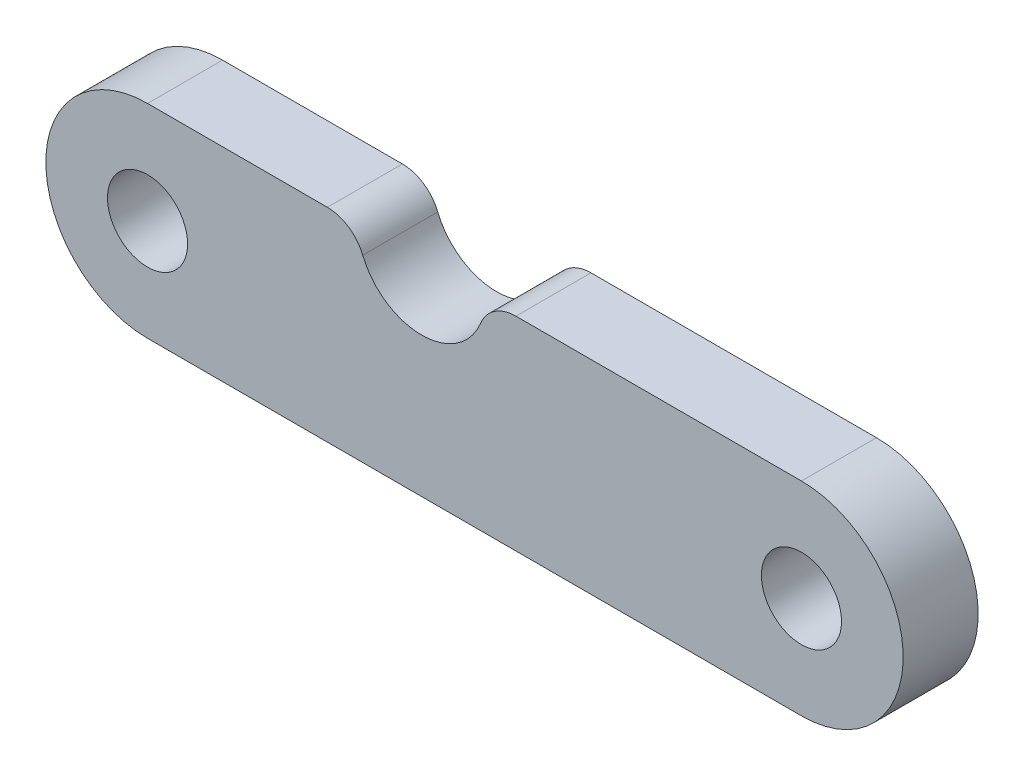
ISO-10303-21;
HEADER;
FILE_DESCRIPTION(('STEP AP214'),'2;1');
FILE_NAME('part.step','',(''),(''),'','','');
FILE_SCHEMA(('AUTOMOTIVE_DESIGN { 1 0 10303 214 1 1 1 1 }'));
ENDSEC;
DATA;
#1=APPLICATION_CONTEXT('core data for automotive mechanical design processes');
#2=APPLICATION_PROTOCOL_DEFINITION('international standard','automotive_design',2000,#1);
#3=PRODUCT_CONTEXT('',#1,'mechanical');
#4=PRODUCT('Part','Part','',(#3));
#5=PRODUCT_RELATED_PRODUCT_CATEGORY('part','',(#4));
#6=PRODUCT_DEFINITION_FORMATION('','',#4);
#7=PRODUCT_DEFINITION_CONTEXT('part definition',#1,'design');
#8=PRODUCT_DEFINITION('design','',#6,#7);
#9=PRODUCT_DEFINITION_SHAPE('','',#8);
#10=(LENGTH_UNIT() NAMED_UNIT(*) SI_UNIT(.MILLI.,.METRE.));
#11=(NAMED_UNIT(*) PLANE_ANGLE_UNIT() SI_UNIT($,.RADIAN.));
#12=(NAMED_UNIT(*) SI_UNIT($,.STERADIAN.) SOLID_ANGLE_UNIT());
#13=UNCERTAINTY_MEASURE_WITH_UNIT(LENGTH_MEASURE(1.E-05),#10,'distance_accuracy_value','');
#14=(GEOMETRIC_REPRESENTATION_CONTEXT(3) GLOBAL_UNCERTAINTY_ASSIGNED_CONTEXT((#13)) GLOBAL_UNIT_ASSIGNED_CONTEXT((#10,
#11,#12)) REPRESENTATION_CONTEXT('',''));
#15=CARTESIAN_POINT('',(0.,0.,0.));
#16=DIRECTION('',(0.,0.,1.));
#17=DIRECTION('',(1.,0.,0.));
#18=AXIS2_PLACEMENT_3D('',#15,#16,#17);
#19=CARTESIAN_POINT('',(25.7175,0.,5.9));
#20=DIRECTION('',(0.,0.,1.));
#21=DIRECTION('',(1.,0.,0.));
#22=AXIS2_PLACEMENT_3D('',#19,#20,#21);
#23=PLANE('',#22);
#24=CARTESIAN_POINT('',(25.7175,0.,5.9));
#25=DIRECTION('',(0.,0.,1.));
#26=DIRECTION('',(1.,0.,0.));
#27=AXIS2_PLACEMENT_3D('',#24,#25,#26);
#28=CIRCLE('',#27,3.15);
#29=CARTESIAN_POINT('',(28.8675,0.,5.9));
#30=VERTEX_POINT('',#29);
#31=EDGE_CURVE('E186',#30,#30,#28,.T.);
#32=ORIENTED_EDGE('',*,*,#31,.F.);
#33=EDGE_LOOP('',(#32));
#34=FACE_BOUND('',#33,.T.);
#35=DIRECTION('',(-1.,0.,0.));
#36=VECTOR('',#35,1.);
#37=CARTESIAN_POINT('',(25.7175,8.00000000000001,5.9));
#38=LINE('',#37,#36);
#39=CARTESIAN_POINT('',(25.7175,8.00000000000001,5.9));
#40=VERTEX_POINT('',#39);
#41=CARTESIAN_POINT('',(3.26059820623029,8.00000000000001,5.9));
#42=VERTEX_POINT('',#41);
#43=EDGE_CURVE('E113',#40,#42,#38,.T.);
#44=ORIENTED_EDGE('',*,*,#43,.T.);
#45=CARTESIAN_POINT('',(3.26059820623029,5.00000000000001,5.9));
#46=DIRECTION('',(0.,0.,1.));
#47=DIRECTION('',(1.,0.,0.));
#48=AXIS2_PLACEMENT_3D('',#45,#46,#47);
#49=CIRCLE('',#48,3.);
#50=CARTESIAN_POINT('',(0.479523773569421,6.12500000000001,5.9));
#51=VERTEX_POINT('',#50);
#52=EDGE_CURVE('E56',#42,#51,#49,.T.);
#53=ORIENTED_EDGE('',*,*,#52,.T.);
#54=CARTESIAN_POINT('',(-4.15560028086537,8.00000000000001,5.9));
#55=DIRECTION('',(0.,0.,-1.));
#56=DIRECTION('',(1.,0.,0.));
#57=AXIS2_PLACEMENT_3D('',#54,#55,#56);
#58=CIRCLE('',#57,5.);
#59=CARTESIAN_POINT('',(-8.79072433530015,6.125,5.9));
#60=VERTEX_POINT('',#59);
#61=EDGE_CURVE('E121',#51,#60,#58,.T.);
#62=ORIENTED_EDGE('',*,*,#61,.T.);
#63=CARTESIAN_POINT('',(-11.571798767961,5.,5.9));
#64=DIRECTION('',(0.,0.,1.));
#65=DIRECTION('',(1.,0.,0.));
#66=AXIS2_PLACEMENT_3D('',#63,#64,#65);
#67=CIRCLE('',#66,3.);
#68=CARTESIAN_POINT('',(-11.571798767961,8.,5.9));
#69=VERTEX_POINT('',#68);
#70=EDGE_CURVE('E63',#60,#69,#67,.T.);
#71=ORIENTED_EDGE('',*,*,#70,.T.);
#72=DIRECTION('',(-1.,0.,0.));
#73=VECTOR('',#72,1.);
#74=CARTESIAN_POINT('',(-9.15560028086537,8.,5.9));
#75=LINE('',#74,#73);
#76=CARTESIAN_POINT('',(-25.7175,8.,5.9));
#77=VERTEX_POINT('',#76);
#78=EDGE_CURVE('E172',#69,#77,#75,.T.);
#79=ORIENTED_EDGE('',*,*,#78,.T.);
#80=CARTESIAN_POINT('',(-25.7175,0.,5.9));
#81=DIRECTION('',(0.,0.,1.));
#82=DIRECTION('',(1.,0.,0.));
#83=AXIS2_PLACEMENT_3D('',#80,#81,#82);
#84=CIRCLE('',#83,8.);
#85=CARTESIAN_POINT('',(-25.7175,-8.00000000000001,5.9));
#86=VERTEX_POINT('',#85);
#87=EDGE_CURVE('E211',#77,#86,#84,.T.);
#88=ORIENTED_EDGE('',*,*,#87,.T.);
#89=DIRECTION('',(1.,0.,0.));
#90=VECTOR('',#89,1.);
#91=CARTESIAN_POINT('',(25.7175,-7.99999999999999,5.9));
#92=LINE('',#91,#90);
#93=CARTESIAN_POINT('',(25.7175,-7.99999999999999,5.9));
#94=VERTEX_POINT('',#93);
#95=EDGE_CURVE('E127',#86,#94,#92,.T.);
#96=ORIENTED_EDGE('',*,*,#95,.T.);
#97=CARTESIAN_POINT('',(25.7175,0.,5.9));
#98=DIRECTION('',(0.,0.,1.));
#99=DIRECTION('',(1.,0.,0.));
#100=AXIS2_PLACEMENT_3D('',#97,#98,#99);
#101=CIRCLE('',#100,8.);
#102=EDGE_CURVE('E122',#94,#40,#101,.T.);
#103=ORIENTED_EDGE('',*,*,#102,.T.);
#104=EDGE_LOOP('',(#44,#53,#62,#71,#79,#88,#96,#103));
#105=FACE_BOUND('',#104,.T.);
#106=CARTESIAN_POINT('',(-25.7175,0.,5.9));
#107=DIRECTION('',(0.,0.,1.));
#108=DIRECTION('',(1.,0.,0.));
#109=AXIS2_PLACEMENT_3D('',#106,#107,#108);
#110=CIRCLE('',#109,3.15);
#111=CARTESIAN_POINT('',(-22.5675,0.,5.9));
#112=VERTEX_POINT('',#111);
#113=EDGE_CURVE('E319',#112,#112,#110,.T.);
#114=ORIENTED_EDGE('',*,*,#113,.F.);
#115=EDGE_LOOP('',(#114));
#116=FACE_BOUND('',#115,.T.);
#117=ADVANCED_FACE('F47',(#34,#105,#116),#23,.T.);
#118=CARTESIAN_POINT('',(25.7175,0.,0.));
#119=DIRECTION('',(0.,0.,1.));
#120=DIRECTION('',(1.,0.,0.));
#121=AXIS2_PLACEMENT_3D('',#118,#119,#120);
#122=PLANE('',#121);
#123=CARTESIAN_POINT('',(-4.15560028086537,8.00000000000001,0.));
#124=DIRECTION('',(0.,0.,-1.));
#125=DIRECTION('',(1.,0.,0.));
#126=AXIS2_PLACEMENT_3D('',#123,#124,#125);
#127=CIRCLE('',#126,5.);
#128=CARTESIAN_POINT('',(0.479523773569421,6.12500000000001,0.));
#129=VERTEX_POINT('',#128);
#130=CARTESIAN_POINT('',(-8.79072433530015,6.125,0.));
#131=VERTEX_POINT('',#130);
#132=EDGE_CURVE('E179',#129,#131,#127,.T.);
#133=ORIENTED_EDGE('',*,*,#132,.F.);
#134=CARTESIAN_POINT('',(3.26059820623029,5.00000000000001,0.));
#135=DIRECTION('',(0.,0.,1.));
#136=DIRECTION('',(1.,0.,0.));
#137=AXIS2_PLACEMENT_3D('',#134,#135,#136);
#138=CIRCLE('',#137,3.);
#139=CARTESIAN_POINT('',(3.26059820623029,8.00000000000001,0.));
#140=VERTEX_POINT('',#139);
#141=EDGE_CURVE('E156',#129,#140,#138,.F.);
#142=ORIENTED_EDGE('',*,*,#141,.T.);
#143=DIRECTION('',(-1.,0.,0.));
#144=VECTOR('',#143,1.);
#145=CARTESIAN_POINT('',(25.7175,8.00000000000001,0.));
#146=LINE('',#145,#144);
#147=CARTESIAN_POINT('',(25.7175,8.00000000000001,0.));
#148=VERTEX_POINT('',#147);
#149=EDGE_CURVE('E178',#148,#140,#146,.T.);
#150=ORIENTED_EDGE('',*,*,#149,.F.);
#151=CARTESIAN_POINT('',(25.7175,0.,0.));
#152=DIRECTION('',(0.,0.,1.));
#153=DIRECTION('',(1.,0.,0.));
#154=AXIS2_PLACEMENT_3D('',#151,#152,#153);
#155=CIRCLE('',#154,8.);
#156=CARTESIAN_POINT('',(25.7175,-7.99999999999999,0.));
#157=VERTEX_POINT('',#156);
#158=EDGE_CURVE('E136',#157,#148,#155,.T.);
#159=ORIENTED_EDGE('',*,*,#158,.F.);
#160=DIRECTION('',(1.,0.,0.));
#161=VECTOR('',#160,1.);
#162=CARTESIAN_POINT('',(25.7175,-7.99999999999999,0.));
#163=LINE('',#162,#161);
#164=CARTESIAN_POINT('',(-25.7175,-8.00000000000001,0.));
#165=VERTEX_POINT('',#164);
#166=EDGE_CURVE('E132',#165,#157,#163,.T.);
#167=ORIENTED_EDGE('',*,*,#166,.F.);
#168=CARTESIAN_POINT('',(-25.7175,0.,0.));
#169=DIRECTION('',(0.,0.,1.));
#170=DIRECTION('',(1.,0.,0.));
#171=AXIS2_PLACEMENT_3D('',#168,#169,#170);
#172=CIRCLE('',#171,8.);
#173=CARTESIAN_POINT('',(-25.7175,8.,0.));
#174=VERTEX_POINT('',#173);
#175=EDGE_CURVE('E192',#174,#165,#172,.T.);
#176=ORIENTED_EDGE('',*,*,#175,.F.);
#177=DIRECTION('',(-1.,0.,0.));
#178=VECTOR('',#177,1.);
#179=CARTESIAN_POINT('',(-9.15560028086537,8.,0.));
#180=LINE('',#179,#178);
#181=CARTESIAN_POINT('',(-11.571798767961,8.,0.));
#182=VERTEX_POINT('',#181);
#183=EDGE_CURVE('E184',#182,#174,#180,.T.);
#184=ORIENTED_EDGE('',*,*,#183,.F.);
#185=CARTESIAN_POINT('',(-11.571798767961,5.,0.));
#186=DIRECTION('',(0.,0.,1.));
#187=DIRECTION('',(1.,0.,0.));
#188=AXIS2_PLACEMENT_3D('',#185,#186,#187);
#189=CIRCLE('',#188,3.);
#190=EDGE_CURVE('E153',#182,#131,#189,.F.);
#191=ORIENTED_EDGE('',*,*,#190,.T.);
#192=EDGE_LOOP('',(#133,#142,#150,#159,#167,#176,#184,#191));
#193=FACE_BOUND('',#192,.T.);
#194=CARTESIAN_POINT('',(25.7175,0.,0.));
#195=DIRECTION('',(0.,0.,1.));
#196=DIRECTION('',(1.,0.,0.));
#197=AXIS2_PLACEMENT_3D('',#194,#195,#196);
#198=CIRCLE('',#197,3.15);
#199=CARTESIAN_POINT('',(28.8675,0.,0.));
#200=VERTEX_POINT('',#199);
#201=EDGE_CURVE('E327',#200,#200,#198,.T.);
#202=ORIENTED_EDGE('',*,*,#201,.T.);
#203=EDGE_LOOP('',(#202));
#204=FACE_BOUND('',#203,.T.);
#205=CARTESIAN_POINT('',(-25.7175,0.,0.));
#206=DIRECTION('',(0.,0.,1.));
#207=DIRECTION('',(1.,0.,0.));
#208=AXIS2_PLACEMENT_3D('',#205,#206,#207);
#209=CIRCLE('',#208,3.15);
#210=CARTESIAN_POINT('',(-22.5675,0.,0.));
#211=VERTEX_POINT('',#210);
#212=EDGE_CURVE('E322',#211,#211,#209,.T.);
#213=ORIENTED_EDGE('',*,*,#212,.T.);
#214=EDGE_LOOP('',(#213));
#215=FACE_BOUND('',#214,.T.);
#216=ADVANCED_FACE('F176',(#193,#204,#215),#122,.F.);
#217=CARTESIAN_POINT('',(25.7175,0.,5.9));
#218=DIRECTION('',(0.,0.,-1.));
#219=DIRECTION('',(-1.,0.,0.));
#220=AXIS2_PLACEMENT_3D('',#217,#218,#219);
#221=CYLINDRICAL_SURFACE('',#220,8.);
#222=ORIENTED_EDGE('',*,*,#158,.T.);
#223=DIRECTION('',(0.,0.,-1.));
#224=VECTOR('',#223,1.);
#225=CARTESIAN_POINT('',(25.7175,8.00000000000001,5.9));
#226=LINE('',#225,#224);
#227=EDGE_CURVE('E117',#40,#148,#226,.T.);
#228=ORIENTED_EDGE('',*,*,#227,.F.);
#229=ORIENTED_EDGE('',*,*,#102,.F.);
#230=DIRECTION('',(0.,0.,-1.));
#231=VECTOR('',#230,1.);
#232=CARTESIAN_POINT('',(25.7175,-7.99999999999999,5.9));
#233=LINE('',#232,#231);
#234=EDGE_CURVE('E197',#94,#157,#233,.T.);
#235=ORIENTED_EDGE('',*,*,#234,.T.);
#236=EDGE_LOOP('',(#222,#228,#229,#235));
#237=FACE_BOUND('',#236,.T.);
#238=ADVANCED_FACE('F134',(#237),#221,.T.);
#239=CARTESIAN_POINT('',(25.7175,8.00000000000001,5.9));
#240=DIRECTION('',(0.,-1.,0.));
#241=DIRECTION('',(1.,0.,0.));
#242=AXIS2_PLACEMENT_3D('',#239,#240,#241);
#243=PLANE('',#242);
#244=ORIENTED_EDGE('',*,*,#149,.T.);
#245=DIRECTION('',(0.,0.,-1.));
#246=VECTOR('',#245,1.);
#247=CARTESIAN_POINT('',(3.26059820623029,8.00000000000001,5.9));
#248=LINE('',#247,#246);
#249=EDGE_CURVE('E71',#140,#42,#248,.F.);
#250=ORIENTED_EDGE('',*,*,#249,.T.);
#251=ORIENTED_EDGE('',*,*,#43,.F.);
#252=ORIENTED_EDGE('',*,*,#227,.T.);
#253=EDGE_LOOP('',(#244,#250,#251,#252));
#254=FACE_BOUND('',#253,.T.);
#255=ADVANCED_FACE('F115',(#254),#243,.F.);
#256=CARTESIAN_POINT('',(-4.15560028086537,8.00000000000001,5.9));
#257=DIRECTION('',(0.,0.,-1.));
#258=DIRECTION('',(-1.,0.,0.));
#259=AXIS2_PLACEMENT_3D('',#256,#257,#258);
#260=CYLINDRICAL_SURFACE('',#259,5.);
#261=ORIENTED_EDGE('',*,*,#61,.F.);
#262=DIRECTION('',(0.,0.,-1.));
#263=VECTOR('',#262,1.);
#264=CARTESIAN_POINT('',(0.479523773569421,6.12500000000001,5.9));
#265=LINE('',#264,#263);
#266=EDGE_CURVE('E143',#51,#129,#265,.T.);
#267=ORIENTED_EDGE('',*,*,#266,.T.);
#268=ORIENTED_EDGE('',*,*,#132,.T.);
#269=DIRECTION('',(0.,0.,-1.));
#270=VECTOR('',#269,1.);
#271=CARTESIAN_POINT('',(-8.79072433530015,6.125,5.9));
#272=LINE('',#271,#270);
#273=EDGE_CURVE('E138',#131,#60,#272,.F.);
#274=ORIENTED_EDGE('',*,*,#273,.T.);
#275=EDGE_LOOP('',(#261,#267,#268,#274));
#276=FACE_BOUND('',#275,.T.);
#277=ADVANCED_FACE('F167',(#276),#260,.F.);
#278=CARTESIAN_POINT('',(-9.15560028086537,8.,5.9));
#279=DIRECTION('',(0.,-1.,0.));
#280=DIRECTION('',(1.,0.,0.));
#281=AXIS2_PLACEMENT_3D('',#278,#279,#280);
#282=PLANE('',#281);
#283=ORIENTED_EDGE('',*,*,#78,.F.);
#284=DIRECTION('',(0.,0.,-1.));
#285=VECTOR('',#284,1.);
#286=CARTESIAN_POINT('',(-11.571798767961,8.,5.9));
#287=LINE('',#286,#285);
#288=EDGE_CURVE('E11',#69,#182,#287,.T.);
#289=ORIENTED_EDGE('',*,*,#288,.T.);
#290=ORIENTED_EDGE('',*,*,#183,.T.);
#291=DIRECTION('',(0.,0.,-1.));
#292=VECTOR('',#291,1.);
#293=CARTESIAN_POINT('',(-25.7175,8.,5.9));
#294=LINE('',#293,#292);
#295=EDGE_CURVE('E139',#77,#174,#294,.T.);
#296=ORIENTED_EDGE('',*,*,#295,.F.);
#297=EDGE_LOOP('',(#283,#289,#290,#296));
#298=FACE_BOUND('',#297,.T.);
#299=ADVANCED_FACE('F213',(#298),#282,.F.);
#300=CARTESIAN_POINT('',(-25.7175,0.,5.9));
#301=DIRECTION('',(0.,0.,-1.));
#302=DIRECTION('',(-1.,0.,0.));
#303=AXIS2_PLACEMENT_3D('',#300,#301,#302);
#304=CYLINDRICAL_SURFACE('',#303,8.);
#305=ORIENTED_EDGE('',*,*,#175,.T.);
#306=DIRECTION('',(0.,0.,-1.));
#307=VECTOR('',#306,1.);
#308=CARTESIAN_POINT('',(-25.7175,-8.00000000000001,5.9));
#309=LINE('',#308,#307);
#310=EDGE_CURVE('E146',#86,#165,#309,.T.);
#311=ORIENTED_EDGE('',*,*,#310,.F.);
#312=ORIENTED_EDGE('',*,*,#87,.F.);
#313=ORIENTED_EDGE('',*,*,#295,.T.);
#314=EDGE_LOOP('',(#305,#311,#312,#313));
#315=FACE_BOUND('',#314,.T.);
#316=ADVANCED_FACE('F209',(#315),#304,.T.);
#317=CARTESIAN_POINT('',(25.7175,-7.99999999999999,5.9));
#318=DIRECTION('',(0.,1.,0.));
#319=DIRECTION('',(-1.,0.,0.));
#320=AXIS2_PLACEMENT_3D('',#317,#318,#319);
#321=PLANE('',#320);
#322=ORIENTED_EDGE('',*,*,#166,.T.);
#323=ORIENTED_EDGE('',*,*,#234,.F.);
#324=ORIENTED_EDGE('',*,*,#95,.F.);
#325=ORIENTED_EDGE('',*,*,#310,.T.);
#326=EDGE_LOOP('',(#322,#323,#324,#325));
#327=FACE_BOUND('',#326,.T.);
#328=ADVANCED_FACE('F204',(#327),#321,.F.);
#329=CARTESIAN_POINT('',(25.7175,0.,5.9));
#330=DIRECTION('',(0.,0.,-1.));
#331=DIRECTION('',(-1.,0.,0.));
#332=AXIS2_PLACEMENT_3D('',#329,#330,#331);
#333=CYLINDRICAL_SURFACE('',#332,3.15);
#334=ORIENTED_EDGE('',*,*,#31,.T.);
#335=EDGE_LOOP('',(#334));
#336=FACE_BOUND('',#335,.T.);
#337=ORIENTED_EDGE('',*,*,#201,.F.);
#338=EDGE_LOOP('',(#337));
#339=FACE_BOUND('',#338,.T.);
#340=ADVANCED_FACE('F231',(#336,#339),#333,.F.);
#341=CARTESIAN_POINT('',(-25.7175,0.,5.9));
#342=DIRECTION('',(0.,0.,-1.));
#343=DIRECTION('',(-1.,0.,0.));
#344=AXIS2_PLACEMENT_3D('',#341,#342,#343);
#345=CYLINDRICAL_SURFACE('',#344,3.15);
#346=ORIENTED_EDGE('',*,*,#113,.T.);
#347=EDGE_LOOP('',(#346));
#348=FACE_BOUND('',#347,.T.);
#349=ORIENTED_EDGE('',*,*,#212,.F.);
#350=EDGE_LOOP('',(#349));
#351=FACE_BOUND('',#350,.T.);
#352=ADVANCED_FACE('F220',(#348,#351),#345,.F.);
#353=CARTESIAN_POINT('',(3.26059820623029,5.00000000000001,5.9));
#354=DIRECTION('',(0.,0.,-1.));
#355=DIRECTION('',(-1.,0.,0.));
#356=AXIS2_PLACEMENT_3D('',#353,#354,#355);
#357=CYLINDRICAL_SURFACE('',#356,3.);
#358=ORIENTED_EDGE('',*,*,#52,.F.);
#359=ORIENTED_EDGE('',*,*,#249,.F.);
#360=ORIENTED_EDGE('',*,*,#141,.F.);
#361=ORIENTED_EDGE('',*,*,#266,.F.);
#362=EDGE_LOOP('',(#358,#359,#360,#361));
#363=FACE_BOUND('',#362,.T.);
#364=ADVANCED_FACE('F174',(#363),#357,.T.);
#365=CARTESIAN_POINT('',(-11.571798767961,5.,5.9));
#366=DIRECTION('',(0.,0.,-1.));
#367=DIRECTION('',(-1.,0.,0.));
#368=AXIS2_PLACEMENT_3D('',#365,#366,#367);
#369=CYLINDRICAL_SURFACE('',#368,3.);
#370=ORIENTED_EDGE('',*,*,#70,.F.);
#371=ORIENTED_EDGE('',*,*,#273,.F.);
#372=ORIENTED_EDGE('',*,*,#190,.F.);
#373=ORIENTED_EDGE('',*,*,#288,.F.);
#374=EDGE_LOOP('',(#370,#371,#372,#373));
#375=FACE_BOUND('',#374,.T.);
#376=ADVANCED_FACE('F49',(#375),#369,.T.);
#377=CLOSED_SHELL('',(#117,#216,#238,#255,#277,#299,#316,#328,#340,#352,#364,#376));
#378=MANIFOLD_SOLID_BREP('B2',#377);
#379=ADVANCED_BREP_SHAPE_REPRESENTATION('',(#18,#378),#14);
#380=SHAPE_DEFINITION_REPRESENTATION(#9,#379);
ENDSEC;
END-ISO-10303-21;
